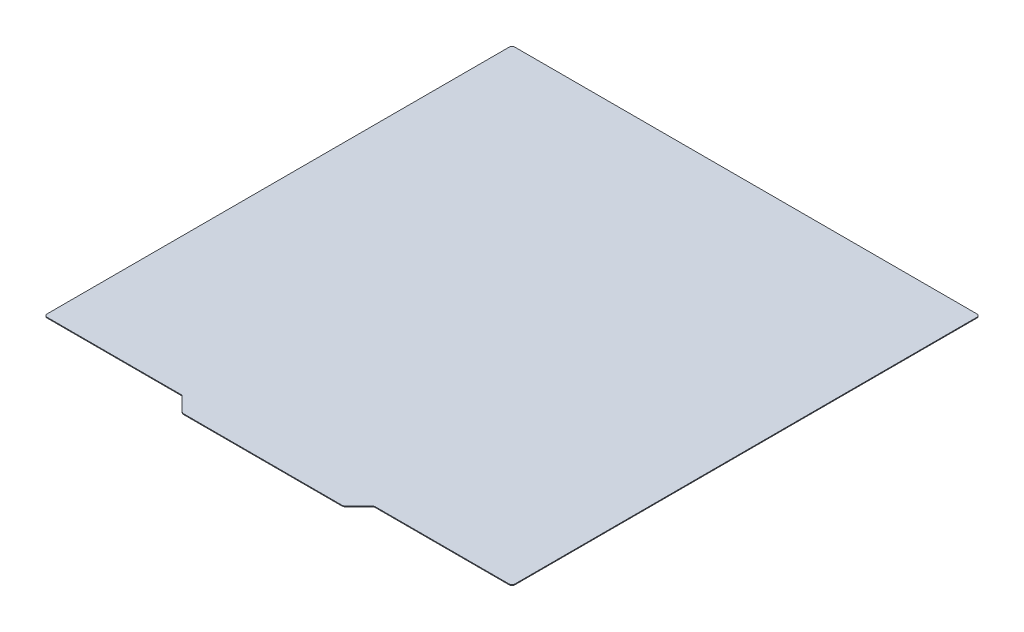
ISO-10303-21;
HEADER;
FILE_DESCRIPTION(('STEP AP214'),'2;1');
FILE_NAME('part.step','',(''),(''),'','','');
FILE_SCHEMA(('AUTOMOTIVE_DESIGN { 1 0 10303 214 1 1 1 1 }'));
ENDSEC;
DATA;
#1=APPLICATION_CONTEXT('core data for automotive mechanical design processes');
#2=APPLICATION_PROTOCOL_DEFINITION('international standard','automotive_design',2000,#1);
#3=PRODUCT_CONTEXT('',#1,'mechanical');
#4=PRODUCT('Part','Part','',(#3));
#5=PRODUCT_RELATED_PRODUCT_CATEGORY('part','',(#4));
#6=PRODUCT_DEFINITION_FORMATION('','',#4);
#7=PRODUCT_DEFINITION_CONTEXT('part definition',#1,'design');
#8=PRODUCT_DEFINITION('design','',#6,#7);
#9=PRODUCT_DEFINITION_SHAPE('','',#8);
#10=(LENGTH_UNIT() NAMED_UNIT(*) SI_UNIT(.MILLI.,.METRE.));
#11=(NAMED_UNIT(*) PLANE_ANGLE_UNIT() SI_UNIT($,.RADIAN.));
#12=(NAMED_UNIT(*) SI_UNIT($,.STERADIAN.) SOLID_ANGLE_UNIT());
#13=UNCERTAINTY_MEASURE_WITH_UNIT(LENGTH_MEASURE(1.E-05),#10,'distance_accuracy_value','');
#14=(GEOMETRIC_REPRESENTATION_CONTEXT(3) GLOBAL_UNCERTAINTY_ASSIGNED_CONTEXT((#13)) GLOBAL_UNIT_ASSIGNED_CONTEXT((#10,
#11,#12)) REPRESENTATION_CONTEXT('',''));
#15=CARTESIAN_POINT('',(0.,0.,0.));
#16=DIRECTION('',(0.,0.,1.));
#17=DIRECTION('',(1.,0.,0.));
#18=AXIS2_PLACEMENT_3D('',#15,#16,#17);
#19=CARTESIAN_POINT('',(-152.5,0.5,152.5));
#20=DIRECTION('',(1.,0.,0.));
#21=DIRECTION('',(0.,0.,-1.));
#22=AXIS2_PLACEMENT_3D('',#19,#20,#21);
#23=PLANE('',#22);
#24=DIRECTION('',(0.,0.,1.));
#25=VECTOR('',#24,1.);
#26=CARTESIAN_POINT('',(-152.5,0.5,152.5));
#27=LINE('',#26,#25);
#28=CARTESIAN_POINT('',(-152.5,0.5,-150.5));
#29=VERTEX_POINT('',#28);
#30=CARTESIAN_POINT('',(-152.5,0.5,150.5));
#31=VERTEX_POINT('',#30);
#32=EDGE_CURVE('E169',#29,#31,#27,.T.);
#33=ORIENTED_EDGE('',*,*,#32,.F.);
#34=DIRECTION('',(0.,-1.,0.));
#35=VECTOR('',#34,1.);
#36=CARTESIAN_POINT('',(-152.5,0.5,-150.5));
#37=LINE('',#36,#35);
#38=CARTESIAN_POINT('',(-152.5,0.,-150.5));
#39=VERTEX_POINT('',#38);
#40=EDGE_CURVE('E154',#29,#39,#37,.T.);
#41=ORIENTED_EDGE('',*,*,#40,.T.);
#42=DIRECTION('',(0.,0.,1.));
#43=VECTOR('',#42,1.);
#44=CARTESIAN_POINT('',(-152.5,0.,152.5));
#45=LINE('',#44,#43);
#46=CARTESIAN_POINT('',(-152.5,0.,150.5));
#47=VERTEX_POINT('',#46);
#48=EDGE_CURVE('E166',#39,#47,#45,.T.);
#49=ORIENTED_EDGE('',*,*,#48,.T.);
#50=DIRECTION('',(0.,-1.,0.));
#51=VECTOR('',#50,1.);
#52=CARTESIAN_POINT('',(-152.5,0.5,150.5));
#53=LINE('',#52,#51);
#54=EDGE_CURVE('E171',#47,#31,#53,.F.);
#55=ORIENTED_EDGE('',*,*,#54,.T.);
#56=EDGE_LOOP('',(#33,#41,#49,#55));
#57=FACE_BOUND('',#56,.T.);
#58=ADVANCED_FACE('F36',(#57),#23,.F.);
#59=CARTESIAN_POINT('',(-62.5,0.5,152.5));
#60=DIRECTION('',(0.,0.,-1.));
#61=DIRECTION('',(-1.,0.,0.));
#62=AXIS2_PLACEMENT_3D('',#59,#60,#61);
#63=PLANE('',#62);
#64=DIRECTION('',(1.,0.,0.));
#65=VECTOR('',#64,1.);
#66=CARTESIAN_POINT('',(-62.5,0.,152.5));
#67=LINE('',#66,#65);
#68=CARTESIAN_POINT('',(-150.5,0.,152.5));
#69=VERTEX_POINT('',#68);
#70=CARTESIAN_POINT('',(-63.3284271247462,0.,152.5));
#71=VERTEX_POINT('',#70);
#72=EDGE_CURVE('E176',#69,#71,#67,.T.);
#73=ORIENTED_EDGE('',*,*,#72,.T.);
#74=DIRECTION('',(0.,-1.,0.));
#75=VECTOR('',#74,1.);
#76=CARTESIAN_POINT('',(-63.3284271247462,0.5,152.5));
#77=LINE('',#76,#75);
#78=CARTESIAN_POINT('',(-63.3284271247462,0.5,152.5));
#79=VERTEX_POINT('',#78);
#80=EDGE_CURVE('E249',#71,#79,#77,.F.);
#81=ORIENTED_EDGE('',*,*,#80,.T.);
#82=DIRECTION('',(1.,0.,0.));
#83=VECTOR('',#82,1.);
#84=CARTESIAN_POINT('',(-62.5,0.5,152.5));
#85=LINE('',#84,#83);
#86=CARTESIAN_POINT('',(-150.5,0.5,152.5));
#87=VERTEX_POINT('',#86);
#88=EDGE_CURVE('E271',#87,#79,#85,.T.);
#89=ORIENTED_EDGE('',*,*,#88,.F.);
#90=DIRECTION('',(0.,-1.,0.));
#91=VECTOR('',#90,1.);
#92=CARTESIAN_POINT('',(-150.5,0.5,152.5));
#93=LINE('',#92,#91);
#94=EDGE_CURVE('E246',#87,#69,#93,.T.);
#95=ORIENTED_EDGE('',*,*,#94,.T.);
#96=EDGE_LOOP('',(#73,#81,#89,#95));
#97=FACE_BOUND('',#96,.T.);
#98=ADVANCED_FACE('F259',(#97),#63,.F.);
#99=CARTESIAN_POINT('',(-52.5,0.5,162.5));
#100=DIRECTION('',(0.707106781186547,0.,-0.707106781186548));
#101=DIRECTION('',(-0.707106781186548,0.,-0.707106781186547));
#102=AXIS2_PLACEMENT_3D('',#99,#100,#101);
#103=PLANE('',#102);
#104=DIRECTION('',(0.707106781186548,0.,0.707106781186547));
#105=VECTOR('',#104,1.);
#106=CARTESIAN_POINT('',(-52.5,0.,162.5));
#107=LINE('',#106,#105);
#108=CARTESIAN_POINT('',(-61.9142135623731,0.,153.085786437627));
#109=VERTEX_POINT('',#108);
#110=CARTESIAN_POINT('',(-53.0857864376269,0.,161.914213562373));
#111=VERTEX_POINT('',#110);
#112=EDGE_CURVE('E179',#109,#111,#107,.T.);
#113=ORIENTED_EDGE('',*,*,#112,.T.);
#114=DIRECTION('',(0.,-1.,0.));
#115=VECTOR('',#114,1.);
#116=CARTESIAN_POINT('',(-53.0857864376269,0.5,161.914213562373));
#117=LINE('',#116,#115);
#118=CARTESIAN_POINT('',(-53.0857864376269,0.5,161.914213562373));
#119=VERTEX_POINT('',#118);
#120=EDGE_CURVE('E244',#111,#119,#117,.F.);
#121=ORIENTED_EDGE('',*,*,#120,.T.);
#122=DIRECTION('',(0.707106781186548,0.,0.707106781186547));
#123=VECTOR('',#122,1.);
#124=CARTESIAN_POINT('',(-52.5,0.5,162.5));
#125=LINE('',#124,#123);
#126=CARTESIAN_POINT('',(-61.9142135623731,0.5,153.085786437627));
#127=VERTEX_POINT('',#126);
#128=EDGE_CURVE('E269',#127,#119,#125,.T.);
#129=ORIENTED_EDGE('',*,*,#128,.F.);
#130=DIRECTION('',(0.,-1.,0.));
#131=VECTOR('',#130,1.);
#132=CARTESIAN_POINT('',(-61.9142135623731,0.,153.085786437627));
#133=LINE('',#132,#131);
#134=EDGE_CURVE('E241',#127,#109,#133,.T.);
#135=ORIENTED_EDGE('',*,*,#134,.T.);
#136=EDGE_LOOP('',(#113,#121,#129,#135));
#137=FACE_BOUND('',#136,.T.);
#138=ADVANCED_FACE('F273',(#137),#103,.F.);
#139=CARTESIAN_POINT('',(-52.5,0.5,162.5));
#140=DIRECTION('',(0.,0.,-1.));
#141=DIRECTION('',(-1.,0.,0.));
#142=AXIS2_PLACEMENT_3D('',#139,#140,#141);
#143=PLANE('',#142);
#144=DIRECTION('',(1.,0.,0.));
#145=VECTOR('',#144,1.);
#146=CARTESIAN_POINT('',(-52.5,0.5,162.5));
#147=LINE('',#146,#145);
#148=CARTESIAN_POINT('',(-51.6715728752538,0.5,162.5));
#149=VERTEX_POINT('',#148);
#150=CARTESIAN_POINT('',(51.6715728752538,0.5,162.5));
#151=VERTEX_POINT('',#150);
#152=EDGE_CURVE('E275',#149,#151,#147,.T.);
#153=ORIENTED_EDGE('',*,*,#152,.F.);
#154=DIRECTION('',(0.,-1.,0.));
#155=VECTOR('',#154,1.);
#156=CARTESIAN_POINT('',(-51.6715728752538,0.5,162.5));
#157=LINE('',#156,#155);
#158=CARTESIAN_POINT('',(-51.6715728752538,0.,162.5));
#159=VERTEX_POINT('',#158);
#160=EDGE_CURVE('E238',#149,#159,#157,.T.);
#161=ORIENTED_EDGE('',*,*,#160,.T.);
#162=DIRECTION('',(1.,0.,0.));
#163=VECTOR('',#162,1.);
#164=CARTESIAN_POINT('',(-52.5,0.,162.5));
#165=LINE('',#164,#163);
#166=CARTESIAN_POINT('',(51.6715728752538,0.,162.5));
#167=VERTEX_POINT('',#166);
#168=EDGE_CURVE('E187',#159,#167,#165,.T.);
#169=ORIENTED_EDGE('',*,*,#168,.T.);
#170=DIRECTION('',(0.,-1.,0.));
#171=VECTOR('',#170,1.);
#172=CARTESIAN_POINT('',(51.6715728752538,0.5,162.5));
#173=LINE('',#172,#171);
#174=EDGE_CURVE('E236',#167,#151,#173,.F.);
#175=ORIENTED_EDGE('',*,*,#174,.T.);
#176=EDGE_LOOP('',(#153,#161,#169,#175));
#177=FACE_BOUND('',#176,.T.);
#178=ADVANCED_FACE('F320',(#177),#143,.F.);
#179=CARTESIAN_POINT('',(52.5,0.5,162.5));
#180=DIRECTION('',(-0.707106781186547,0.,-0.707106781186548));
#181=DIRECTION('',(-0.707106781186548,0.,0.707106781186547));
#182=AXIS2_PLACEMENT_3D('',#179,#180,#181);
#183=PLANE('',#182);
#184=DIRECTION('',(0.707106781186548,0.,-0.707106781186547));
#185=VECTOR('',#184,1.);
#186=CARTESIAN_POINT('',(52.5,0.,162.5));
#187=LINE('',#186,#185);
#188=CARTESIAN_POINT('',(53.0857864376269,0.,161.914213562373));
#189=VERTEX_POINT('',#188);
#190=CARTESIAN_POINT('',(61.9142135623731,0.,153.085786437627));
#191=VERTEX_POINT('',#190);
#192=EDGE_CURVE('E190',#189,#191,#187,.T.);
#193=ORIENTED_EDGE('',*,*,#192,.T.);
#194=DIRECTION('',(0.,-1.,0.));
#195=VECTOR('',#194,1.);
#196=CARTESIAN_POINT('',(61.9142135623731,0.5,153.085786437627));
#197=LINE('',#196,#195);
#198=CARTESIAN_POINT('',(61.9142135623731,0.5,153.085786437627));
#199=VERTEX_POINT('',#198);
#200=EDGE_CURVE('E234',#191,#199,#197,.F.);
#201=ORIENTED_EDGE('',*,*,#200,.T.);
#202=DIRECTION('',(0.707106781186548,0.,-0.707106781186547));
#203=VECTOR('',#202,1.);
#204=CARTESIAN_POINT('',(52.5,0.5,162.5));
#205=LINE('',#204,#203);
#206=CARTESIAN_POINT('',(53.0857864376269,0.5,161.914213562373));
#207=VERTEX_POINT('',#206);
#208=EDGE_CURVE('E278',#207,#199,#205,.T.);
#209=ORIENTED_EDGE('',*,*,#208,.F.);
#210=DIRECTION('',(0.,-1.,0.));
#211=VECTOR('',#210,1.);
#212=CARTESIAN_POINT('',(53.0857864376269,0.5,161.914213562373));
#213=LINE('',#212,#211);
#214=EDGE_CURVE('E231',#207,#189,#213,.T.);
#215=ORIENTED_EDGE('',*,*,#214,.T.);
#216=EDGE_LOOP('',(#193,#201,#209,#215));
#217=FACE_BOUND('',#216,.T.);
#218=ADVANCED_FACE('F311',(#217),#183,.F.);
#219=CARTESIAN_POINT('',(152.5,0.5,152.5));
#220=DIRECTION('',(0.,0.,-1.));
#221=DIRECTION('',(-1.,0.,0.));
#222=AXIS2_PLACEMENT_3D('',#219,#220,#221);
#223=PLANE('',#222);
#224=DIRECTION('',(1.,0.,0.));
#225=VECTOR('',#224,1.);
#226=CARTESIAN_POINT('',(152.5,0.,152.5));
#227=LINE('',#226,#225);
#228=CARTESIAN_POINT('',(63.3284271247462,0.,152.5));
#229=VERTEX_POINT('',#228);
#230=CARTESIAN_POINT('',(150.5,0.,152.5));
#231=VERTEX_POINT('',#230);
#232=EDGE_CURVE('E193',#229,#231,#227,.T.);
#233=ORIENTED_EDGE('',*,*,#232,.T.);
#234=DIRECTION('',(0.,-1.,0.));
#235=VECTOR('',#234,1.);
#236=CARTESIAN_POINT('',(150.5,0.5,152.5));
#237=LINE('',#236,#235);
#238=CARTESIAN_POINT('',(150.5,0.5,152.5));
#239=VERTEX_POINT('',#238);
#240=EDGE_CURVE('E229',#231,#239,#237,.F.);
#241=ORIENTED_EDGE('',*,*,#240,.T.);
#242=DIRECTION('',(1.,0.,0.));
#243=VECTOR('',#242,1.);
#244=CARTESIAN_POINT('',(152.5,0.5,152.5));
#245=LINE('',#244,#243);
#246=CARTESIAN_POINT('',(63.3284271247462,0.5,152.5));
#247=VERTEX_POINT('',#246);
#248=EDGE_CURVE('E285',#247,#239,#245,.T.);
#249=ORIENTED_EDGE('',*,*,#248,.F.);
#250=DIRECTION('',(0.,-1.,0.));
#251=VECTOR('',#250,1.);
#252=CARTESIAN_POINT('',(63.3284271247462,0.,152.5));
#253=LINE('',#252,#251);
#254=EDGE_CURVE('E226',#247,#229,#253,.T.);
#255=ORIENTED_EDGE('',*,*,#254,.T.);
#256=EDGE_LOOP('',(#233,#241,#249,#255));
#257=FACE_BOUND('',#256,.T.);
#258=ADVANCED_FACE('F302',(#257),#223,.F.);
#259=CARTESIAN_POINT('',(152.5,0.5,152.5));
#260=DIRECTION('',(-1.,0.,0.));
#261=DIRECTION('',(0.,0.,1.));
#262=AXIS2_PLACEMENT_3D('',#259,#260,#261);
#263=PLANE('',#262);
#264=DIRECTION('',(0.,0.,-1.));
#265=VECTOR('',#264,1.);
#266=CARTESIAN_POINT('',(152.5,0.,152.5));
#267=LINE('',#266,#265);
#268=CARTESIAN_POINT('',(152.5,0.,150.5));
#269=VERTEX_POINT('',#268);
#270=CARTESIAN_POINT('',(152.5,0.,-150.5));
#271=VERTEX_POINT('',#270);
#272=EDGE_CURVE('E196',#269,#271,#267,.T.);
#273=ORIENTED_EDGE('',*,*,#272,.T.);
#274=DIRECTION('',(0.,-1.,0.));
#275=VECTOR('',#274,1.);
#276=CARTESIAN_POINT('',(152.5,0.5,-150.5));
#277=LINE('',#276,#275);
#278=CARTESIAN_POINT('',(152.5,0.5,-150.5));
#279=VERTEX_POINT('',#278);
#280=EDGE_CURVE('E51',#271,#279,#277,.F.);
#281=ORIENTED_EDGE('',*,*,#280,.T.);
#282=DIRECTION('',(0.,0.,-1.));
#283=VECTOR('',#282,1.);
#284=CARTESIAN_POINT('',(152.5,0.5,152.5));
#285=LINE('',#284,#283);
#286=CARTESIAN_POINT('',(152.5,0.5,150.5));
#287=VERTEX_POINT('',#286);
#288=EDGE_CURVE('E286',#287,#279,#285,.T.);
#289=ORIENTED_EDGE('',*,*,#288,.F.);
#290=DIRECTION('',(0.,-1.,0.));
#291=VECTOR('',#290,1.);
#292=CARTESIAN_POINT('',(152.5,0.5,150.5));
#293=LINE('',#292,#291);
#294=EDGE_CURVE('E222',#287,#269,#293,.T.);
#295=ORIENTED_EDGE('',*,*,#294,.T.);
#296=EDGE_LOOP('',(#273,#281,#289,#295));
#297=FACE_BOUND('',#296,.T.);
#298=ADVANCED_FACE('F295',(#297),#263,.F.);
#299=CARTESIAN_POINT('',(152.5,0.5,-152.5));
#300=DIRECTION('',(0.,0.,1.));
#301=DIRECTION('',(1.,0.,0.));
#302=AXIS2_PLACEMENT_3D('',#299,#300,#301);
#303=PLANE('',#302);
#304=DIRECTION('',(-1.,0.,0.));
#305=VECTOR('',#304,1.);
#306=CARTESIAN_POINT('',(152.5,0.,-152.5));
#307=LINE('',#306,#305);
#308=CARTESIAN_POINT('',(150.5,0.,-152.5));
#309=VERTEX_POINT('',#308);
#310=CARTESIAN_POINT('',(-150.5,0.,-152.5));
#311=VERTEX_POINT('',#310);
#312=EDGE_CURVE('E198',#309,#311,#307,.T.);
#313=ORIENTED_EDGE('',*,*,#312,.T.);
#314=DIRECTION('',(0.,-1.,0.));
#315=VECTOR('',#314,1.);
#316=CARTESIAN_POINT('',(-150.5,0.5,-152.5));
#317=LINE('',#316,#315);
#318=CARTESIAN_POINT('',(-150.5,0.5,-152.5));
#319=VERTEX_POINT('',#318);
#320=EDGE_CURVE('E155',#311,#319,#317,.F.);
#321=ORIENTED_EDGE('',*,*,#320,.T.);
#322=DIRECTION('',(-1.,0.,0.));
#323=VECTOR('',#322,1.);
#324=CARTESIAN_POINT('',(152.5,0.5,-152.5));
#325=LINE('',#324,#323);
#326=CARTESIAN_POINT('',(150.5,0.5,-152.5));
#327=VERTEX_POINT('',#326);
#328=EDGE_CURVE('E182',#327,#319,#325,.T.);
#329=ORIENTED_EDGE('',*,*,#328,.F.);
#330=DIRECTION('',(0.,-1.,0.));
#331=VECTOR('',#330,1.);
#332=CARTESIAN_POINT('',(150.5,0.5,-152.5));
#333=LINE('',#332,#331);
#334=EDGE_CURVE('E160',#327,#309,#333,.T.);
#335=ORIENTED_EDGE('',*,*,#334,.T.);
#336=EDGE_LOOP('',(#313,#321,#329,#335));
#337=FACE_BOUND('',#336,.T.);
#338=ADVANCED_FACE('F291',(#337),#303,.F.);
#339=CARTESIAN_POINT('',(0.,0.5,0.));
#340=DIRECTION('',(0.,1.,0.));
#341=DIRECTION('',(0.,0.,1.));
#342=AXIS2_PLACEMENT_3D('',#339,#340,#341);
#343=PLANE('',#342);
#344=ORIENTED_EDGE('',*,*,#328,.T.);
#345=CARTESIAN_POINT('',(-150.5,0.5,-150.5));
#346=DIRECTION('',(0.,1.,0.));
#347=DIRECTION('',(0.,0.,1.));
#348=AXIS2_PLACEMENT_3D('',#345,#346,#347);
#349=CIRCLE('',#348,2.);
#350=EDGE_CURVE('E220',#319,#29,#349,.T.);
#351=ORIENTED_EDGE('',*,*,#350,.T.);
#352=ORIENTED_EDGE('',*,*,#32,.T.);
#353=CARTESIAN_POINT('',(-150.5,0.5,150.5));
#354=DIRECTION('',(0.,1.,0.));
#355=DIRECTION('',(0.,0.,1.));
#356=AXIS2_PLACEMENT_3D('',#353,#354,#355);
#357=CIRCLE('',#356,2.);
#358=EDGE_CURVE('E213',#31,#87,#357,.T.);
#359=ORIENTED_EDGE('',*,*,#358,.T.);
#360=ORIENTED_EDGE('',*,*,#88,.T.);
#361=CARTESIAN_POINT('',(-63.3284271247462,0.5,154.5));
#362=DIRECTION('',(0.,1.,0.));
#363=DIRECTION('',(0.,0.,1.));
#364=AXIS2_PLACEMENT_3D('',#361,#362,#363);
#365=CIRCLE('',#364,2.);
#366=EDGE_CURVE('E11',#79,#127,#365,.F.);
#367=ORIENTED_EDGE('',*,*,#366,.T.);
#368=ORIENTED_EDGE('',*,*,#128,.T.);
#369=CARTESIAN_POINT('',(-51.6715728752538,0.5,160.5));
#370=DIRECTION('',(0.,1.,0.));
#371=DIRECTION('',(0.,0.,1.));
#372=AXIS2_PLACEMENT_3D('',#369,#370,#371);
#373=CIRCLE('',#372,2.);
#374=EDGE_CURVE('E215',#119,#149,#373,.T.);
#375=ORIENTED_EDGE('',*,*,#374,.T.);
#376=ORIENTED_EDGE('',*,*,#152,.T.);
#377=CARTESIAN_POINT('',(51.6715728752538,0.5,160.5));
#378=DIRECTION('',(0.,1.,0.));
#379=DIRECTION('',(0.,0.,1.));
#380=AXIS2_PLACEMENT_3D('',#377,#378,#379);
#381=CIRCLE('',#380,2.);
#382=EDGE_CURVE('E211',#151,#207,#381,.T.);
#383=ORIENTED_EDGE('',*,*,#382,.T.);
#384=ORIENTED_EDGE('',*,*,#208,.T.);
#385=CARTESIAN_POINT('',(63.3284271247462,0.5,154.5));
#386=DIRECTION('',(0.,1.,0.));
#387=DIRECTION('',(0.,0.,1.));
#388=AXIS2_PLACEMENT_3D('',#385,#386,#387);
#389=CIRCLE('',#388,2.);
#390=EDGE_CURVE('E253',#199,#247,#389,.F.);
#391=ORIENTED_EDGE('',*,*,#390,.T.);
#392=ORIENTED_EDGE('',*,*,#248,.T.);
#393=CARTESIAN_POINT('',(150.5,0.5,150.5));
#394=DIRECTION('',(0.,1.,0.));
#395=DIRECTION('',(0.,0.,1.));
#396=AXIS2_PLACEMENT_3D('',#393,#394,#395);
#397=CIRCLE('',#396,2.);
#398=EDGE_CURVE('E58',#239,#287,#397,.T.);
#399=ORIENTED_EDGE('',*,*,#398,.T.);
#400=ORIENTED_EDGE('',*,*,#288,.T.);
#401=CARTESIAN_POINT('',(150.5,0.5,-150.5));
#402=DIRECTION('',(0.,1.,0.));
#403=DIRECTION('',(0.,0.,1.));
#404=AXIS2_PLACEMENT_3D('',#401,#402,#403);
#405=CIRCLE('',#404,2.);
#406=EDGE_CURVE('E218',#279,#327,#405,.T.);
#407=ORIENTED_EDGE('',*,*,#406,.T.);
#408=EDGE_LOOP('',(#344,#351,#352,#359,#360,#367,#368,#375,#376,#383,#384,#391,#392,#399,#400,#407));
#409=FACE_BOUND('',#408,.T.);
#410=ADVANCED_FACE('F268',(#409),#343,.T.);
#411=CARTESIAN_POINT('',(0.,0.,0.));
#412=DIRECTION('',(0.,1.,0.));
#413=DIRECTION('',(0.,0.,1.));
#414=AXIS2_PLACEMENT_3D('',#411,#412,#413);
#415=PLANE('',#414);
#416=ORIENTED_EDGE('',*,*,#48,.F.);
#417=CARTESIAN_POINT('',(-150.5,0.,-150.5));
#418=DIRECTION('',(0.,1.,0.));
#419=DIRECTION('',(0.,0.,1.));
#420=AXIS2_PLACEMENT_3D('',#417,#418,#419);
#421=CIRCLE('',#420,2.);
#422=EDGE_CURVE('E150',#39,#311,#421,.F.);
#423=ORIENTED_EDGE('',*,*,#422,.T.);
#424=ORIENTED_EDGE('',*,*,#312,.F.);
#425=CARTESIAN_POINT('',(150.5,0.,-150.5));
#426=DIRECTION('',(0.,1.,0.));
#427=DIRECTION('',(0.,0.,1.));
#428=AXIS2_PLACEMENT_3D('',#425,#426,#427);
#429=CIRCLE('',#428,2.);
#430=EDGE_CURVE('E161',#309,#271,#429,.F.);
#431=ORIENTED_EDGE('',*,*,#430,.T.);
#432=ORIENTED_EDGE('',*,*,#272,.F.);
#433=CARTESIAN_POINT('',(150.5,0.,150.5));
#434=DIRECTION('',(0.,1.,0.));
#435=DIRECTION('',(0.,0.,1.));
#436=AXIS2_PLACEMENT_3D('',#433,#434,#435);
#437=CIRCLE('',#436,2.);
#438=EDGE_CURVE('E205',#269,#231,#437,.F.);
#439=ORIENTED_EDGE('',*,*,#438,.T.);
#440=ORIENTED_EDGE('',*,*,#232,.F.);
#441=CARTESIAN_POINT('',(63.3284271247462,0.,154.5));
#442=DIRECTION('',(0.,1.,0.));
#443=DIRECTION('',(0.,0.,1.));
#444=AXIS2_PLACEMENT_3D('',#441,#442,#443);
#445=CIRCLE('',#444,2.);
#446=EDGE_CURVE('E251',#229,#191,#445,.T.);
#447=ORIENTED_EDGE('',*,*,#446,.T.);
#448=ORIENTED_EDGE('',*,*,#192,.F.);
#449=CARTESIAN_POINT('',(51.6715728752538,0.,160.5));
#450=DIRECTION('',(0.,1.,0.));
#451=DIRECTION('',(0.,0.,1.));
#452=AXIS2_PLACEMENT_3D('',#449,#450,#451);
#453=CIRCLE('',#452,2.);
#454=EDGE_CURVE('E170',#189,#167,#453,.F.);
#455=ORIENTED_EDGE('',*,*,#454,.T.);
#456=ORIENTED_EDGE('',*,*,#168,.F.);
#457=CARTESIAN_POINT('',(-51.6715728752538,0.,160.5));
#458=DIRECTION('',(0.,1.,0.));
#459=DIRECTION('',(0.,0.,1.));
#460=AXIS2_PLACEMENT_3D('',#457,#458,#459);
#461=CIRCLE('',#460,2.);
#462=EDGE_CURVE('E203',#159,#111,#461,.F.);
#463=ORIENTED_EDGE('',*,*,#462,.T.);
#464=ORIENTED_EDGE('',*,*,#112,.F.);
#465=CARTESIAN_POINT('',(-63.3284271247462,0.,154.5));
#466=DIRECTION('',(0.,1.,0.));
#467=DIRECTION('',(0.,0.,1.));
#468=AXIS2_PLACEMENT_3D('',#465,#466,#467);
#469=CIRCLE('',#468,2.);
#470=EDGE_CURVE('E44',#109,#71,#469,.T.);
#471=ORIENTED_EDGE('',*,*,#470,.T.);
#472=ORIENTED_EDGE('',*,*,#72,.F.);
#473=CARTESIAN_POINT('',(-150.5,0.,150.5));
#474=DIRECTION('',(0.,1.,0.));
#475=DIRECTION('',(0.,0.,1.));
#476=AXIS2_PLACEMENT_3D('',#473,#474,#475);
#477=CIRCLE('',#476,2.);
#478=EDGE_CURVE('E175',#69,#47,#477,.F.);
#479=ORIENTED_EDGE('',*,*,#478,.T.);
#480=EDGE_LOOP('',(#416,#423,#424,#431,#432,#439,#440,#447,#448,#455,#456,#463,#464,#471,#472,#479));
#481=FACE_BOUND('',#480,.T.);
#482=ADVANCED_FACE('F173',(#481),#415,.F.);
#483=CARTESIAN_POINT('',(-150.5,0.5,-150.5));
#484=DIRECTION('',(0.,-1.,0.));
#485=DIRECTION('',(0.,0.,-1.));
#486=AXIS2_PLACEMENT_3D('',#483,#484,#485);
#487=CYLINDRICAL_SURFACE('',#486,2.);
#488=ORIENTED_EDGE('',*,*,#350,.F.);
#489=ORIENTED_EDGE('',*,*,#320,.F.);
#490=ORIENTED_EDGE('',*,*,#422,.F.);
#491=ORIENTED_EDGE('',*,*,#40,.F.);
#492=EDGE_LOOP('',(#488,#489,#490,#491));
#493=FACE_BOUND('',#492,.T.);
#494=ADVANCED_FACE('F153',(#493),#487,.T.);
#495=CARTESIAN_POINT('',(150.5,0.5,-150.5));
#496=DIRECTION('',(0.,-1.,0.));
#497=DIRECTION('',(0.,0.,-1.));
#498=AXIS2_PLACEMENT_3D('',#495,#496,#497);
#499=CYLINDRICAL_SURFACE('',#498,2.);
#500=ORIENTED_EDGE('',*,*,#406,.F.);
#501=ORIENTED_EDGE('',*,*,#280,.F.);
#502=ORIENTED_EDGE('',*,*,#430,.F.);
#503=ORIENTED_EDGE('',*,*,#334,.F.);
#504=EDGE_LOOP('',(#500,#501,#502,#503));
#505=FACE_BOUND('',#504,.T.);
#506=ADVANCED_FACE('F293',(#505),#499,.T.);
#507=CARTESIAN_POINT('',(150.5,0.5,150.5));
#508=DIRECTION('',(0.,-1.,0.));
#509=DIRECTION('',(0.,0.,-1.));
#510=AXIS2_PLACEMENT_3D('',#507,#508,#509);
#511=CYLINDRICAL_SURFACE('',#510,2.);
#512=ORIENTED_EDGE('',*,*,#398,.F.);
#513=ORIENTED_EDGE('',*,*,#240,.F.);
#514=ORIENTED_EDGE('',*,*,#438,.F.);
#515=ORIENTED_EDGE('',*,*,#294,.F.);
#516=EDGE_LOOP('',(#512,#513,#514,#515));
#517=FACE_BOUND('',#516,.T.);
#518=ADVANCED_FACE('F298',(#517),#511,.T.);
#519=CARTESIAN_POINT('',(63.3284271247462,0.5,154.5));
#520=DIRECTION('',(0.,1.,0.));
#521=DIRECTION('',(0.,0.,1.));
#522=AXIS2_PLACEMENT_3D('',#519,#520,#521);
#523=CYLINDRICAL_SURFACE('',#522,2.);
#524=ORIENTED_EDGE('',*,*,#390,.F.);
#525=ORIENTED_EDGE('',*,*,#200,.F.);
#526=ORIENTED_EDGE('',*,*,#446,.F.);
#527=ORIENTED_EDGE('',*,*,#254,.F.);
#528=EDGE_LOOP('',(#524,#525,#526,#527));
#529=FACE_BOUND('',#528,.T.);
#530=ADVANCED_FACE('F307',(#529),#523,.F.);
#531=CARTESIAN_POINT('',(-51.6715728752538,0.5,160.5));
#532=DIRECTION('',(0.,-1.,0.));
#533=DIRECTION('',(0.,0.,-1.));
#534=AXIS2_PLACEMENT_3D('',#531,#532,#533);
#535=CYLINDRICAL_SURFACE('',#534,2.);
#536=ORIENTED_EDGE('',*,*,#374,.F.);
#537=ORIENTED_EDGE('',*,*,#120,.F.);
#538=ORIENTED_EDGE('',*,*,#462,.F.);
#539=ORIENTED_EDGE('',*,*,#160,.F.);
#540=EDGE_LOOP('',(#536,#537,#538,#539));
#541=FACE_BOUND('',#540,.T.);
#542=ADVANCED_FACE('F323',(#541),#535,.T.);
#543=CARTESIAN_POINT('',(-63.3284271247462,0.5,154.5));
#544=DIRECTION('',(0.,1.,0.));
#545=DIRECTION('',(0.,0.,1.));
#546=AXIS2_PLACEMENT_3D('',#543,#544,#545);
#547=CYLINDRICAL_SURFACE('',#546,2.);
#548=ORIENTED_EDGE('',*,*,#366,.F.);
#549=ORIENTED_EDGE('',*,*,#80,.F.);
#550=ORIENTED_EDGE('',*,*,#470,.F.);
#551=ORIENTED_EDGE('',*,*,#134,.F.);
#552=EDGE_LOOP('',(#548,#549,#550,#551));
#553=FACE_BOUND('',#552,.T.);
#554=ADVANCED_FACE('F264',(#553),#547,.F.);
#555=CARTESIAN_POINT('',(-150.5,0.5,150.5));
#556=DIRECTION('',(0.,-1.,0.));
#557=DIRECTION('',(0.,0.,-1.));
#558=AXIS2_PLACEMENT_3D('',#555,#556,#557);
#559=CYLINDRICAL_SURFACE('',#558,2.);
#560=ORIENTED_EDGE('',*,*,#358,.F.);
#561=ORIENTED_EDGE('',*,*,#54,.F.);
#562=ORIENTED_EDGE('',*,*,#478,.F.);
#563=ORIENTED_EDGE('',*,*,#94,.F.);
#564=EDGE_LOOP('',(#560,#561,#562,#563));
#565=FACE_BOUND('',#564,.T.);
#566=ADVANCED_FACE('F330',(#565),#559,.T.);
#567=CARTESIAN_POINT('',(51.6715728752538,0.5,160.5));
#568=DIRECTION('',(0.,-1.,0.));
#569=DIRECTION('',(0.,0.,-1.));
#570=AXIS2_PLACEMENT_3D('',#567,#568,#569);
#571=CYLINDRICAL_SURFACE('',#570,2.);
#572=ORIENTED_EDGE('',*,*,#382,.F.);
#573=ORIENTED_EDGE('',*,*,#174,.F.);
#574=ORIENTED_EDGE('',*,*,#454,.F.);
#575=ORIENTED_EDGE('',*,*,#214,.F.);
#576=EDGE_LOOP('',(#572,#573,#574,#575));
#577=FACE_BOUND('',#576,.T.);
#578=ADVANCED_FACE('F38',(#577),#571,.T.);
#579=CLOSED_SHELL('',(#58,#98,#138,#178,#218,#258,#298,#338,#410,#482,#494,#506,#518,#530,#542,
#554,#566,#578));
#580=MANIFOLD_SOLID_BREP('B2',#579);
#581=ADVANCED_BREP_SHAPE_REPRESENTATION('',(#18,#580),#14);
#582=SHAPE_DEFINITION_REPRESENTATION(#9,#581);
ENDSEC;
END-ISO-10303-21;
